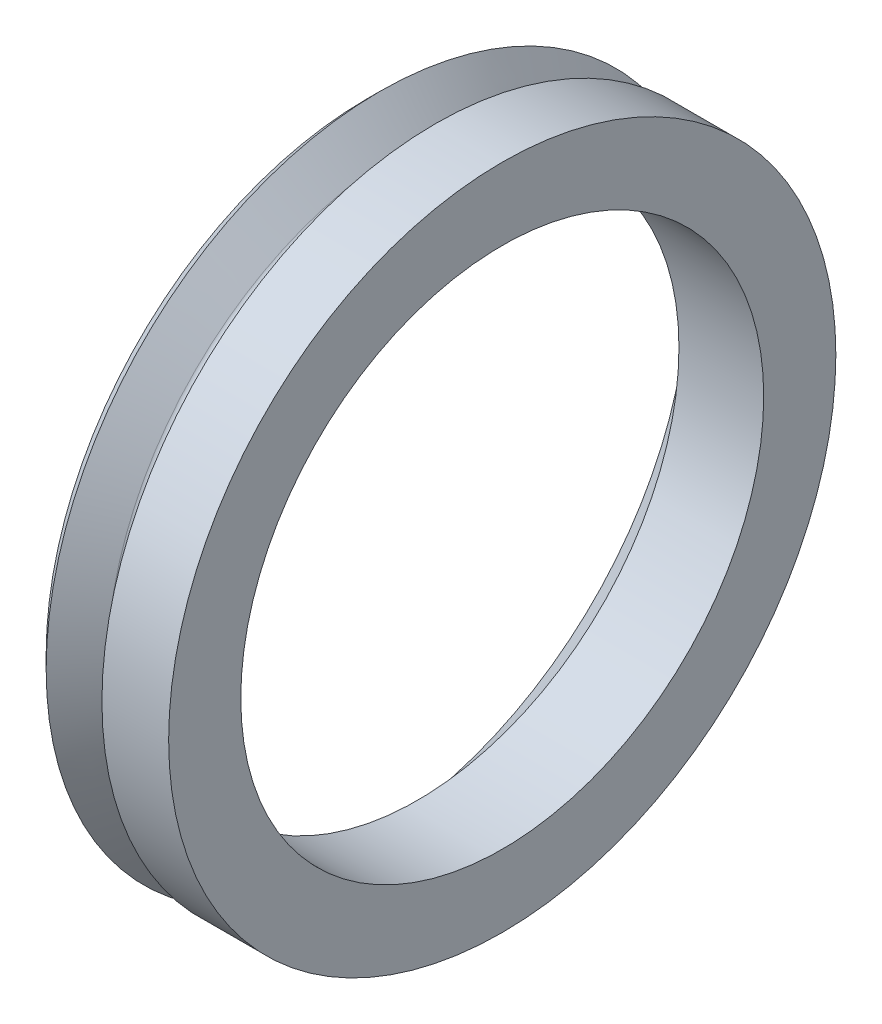
ISO-10303-21;
HEADER;
FILE_DESCRIPTION(('STEP AP214'),'2;1');
FILE_NAME('part.step','',(''),(''),'','','');
FILE_SCHEMA(('AUTOMOTIVE_DESIGN { 1 0 10303 214 1 1 1 1 }'));
ENDSEC;
DATA;
#1=APPLICATION_CONTEXT('core data for automotive mechanical design processes');
#2=APPLICATION_PROTOCOL_DEFINITION('international standard','automotive_design',2000,#1);
#3=PRODUCT_CONTEXT('',#1,'mechanical');
#4=PRODUCT('Part','Part','',(#3));
#5=PRODUCT_RELATED_PRODUCT_CATEGORY('part','',(#4));
#6=PRODUCT_DEFINITION_FORMATION('','',#4);
#7=PRODUCT_DEFINITION_CONTEXT('part definition',#1,'design');
#8=PRODUCT_DEFINITION('design','',#6,#7);
#9=PRODUCT_DEFINITION_SHAPE('','',#8);
#10=(LENGTH_UNIT() NAMED_UNIT(*) SI_UNIT(.MILLI.,.METRE.));
#11=(NAMED_UNIT(*) PLANE_ANGLE_UNIT() SI_UNIT($,.RADIAN.));
#12=(NAMED_UNIT(*) SI_UNIT($,.STERADIAN.) SOLID_ANGLE_UNIT());
#13=UNCERTAINTY_MEASURE_WITH_UNIT(LENGTH_MEASURE(1.E-05),#10,'distance_accuracy_value','');
#14=(GEOMETRIC_REPRESENTATION_CONTEXT(3) GLOBAL_UNCERTAINTY_ASSIGNED_CONTEXT((#13)) GLOBAL_UNIT_ASSIGNED_CONTEXT((#10,
#11,#12)) REPRESENTATION_CONTEXT('',''));
#15=CARTESIAN_POINT('',(0.,0.,0.));
#16=DIRECTION('',(0.,0.,1.));
#17=DIRECTION('',(1.,0.,0.));
#18=AXIS2_PLACEMENT_3D('',#15,#16,#17);
#19=CARTESIAN_POINT('',(0.707106781305811,0.,0.));
#20=DIRECTION('',(-1.,0.,0.));
#21=DIRECTION('',(0.,0.,1.));
#22=AXIS2_PLACEMENT_3D('',#19,#20,#21);
#23=CONICAL_SURFACE('',#22,18.4999999997899,0.866118799907619);
#24=CARTESIAN_POINT('',(0.707106781248967,0.,0.));
#25=DIRECTION('',(1.,0.,0.));
#26=DIRECTION('',(0.,0.,-1.));
#27=AXIS2_PLACEMENT_3D('',#24,#25,#26);
#28=CIRCLE('',#27,18.5000000000173);
#29=CARTESIAN_POINT('',(0.707106781248967,0.,-18.5000000000173));
#30=VERTEX_POINT('',#29);
#31=EDGE_CURVE('E30',#30,#30,#28,.F.);
#32=ORIENTED_EDGE('',*,*,#31,.F.);
#33=EDGE_LOOP('',(#32));
#34=FACE_BOUND('',#33,.T.);
#35=CARTESIAN_POINT('',(2.26609548856383,0.,0.));
#36=DIRECTION('',(1.,0.,0.));
#37=DIRECTION('',(0.,0.,-1.));
#38=AXIS2_PLACEMENT_3D('',#35,#36,#37);
#39=CIRCLE('',#38,16.6665773775966);
#40=CARTESIAN_POINT('',(2.26609548856383,0.,-16.6665773775966));
#41=VERTEX_POINT('',#40);
#42=EDGE_CURVE('E27',#41,#41,#39,.F.);
#43=ORIENTED_EDGE('',*,*,#42,.T.);
#44=EDGE_LOOP('',(#43));
#45=FACE_BOUND('',#44,.T.);
#46=ADVANCED_FACE('F15',(#34,#45),#23,.T.);
#47=CARTESIAN_POINT('',(2.64700573138622,0.,0.));
#48=DIRECTION('',(1.,0.,0.));
#49=DIRECTION('',(0.,0.,-1.));
#50=AXIS2_PLACEMENT_3D('',#47,#48,#49);
#51=TOROIDAL_SURFACE('',#50,16.9904714758957,0.499999999999995);
#52=CARTESIAN_POINT('',(3.1102329847954,0.,0.));
#53=DIRECTION('',(1.,0.,0.));
#54=DIRECTION('',(0.,0.,-1.));
#55=AXIS2_PLACEMENT_3D('',#52,#53,#54);
#56=CIRCLE('',#55,16.8022680973081);
#57=CARTESIAN_POINT('',(3.1102329847954,0.,-16.8022680973081));
#58=VERTEX_POINT('',#57);
#59=EDGE_CURVE('E33',#58,#58,#56,.T.);
#60=ORIENTED_EDGE('',*,*,#59,.F.);
#61=EDGE_LOOP('',(#60));
#62=FACE_BOUND('',#61,.T.);
#63=ORIENTED_EDGE('',*,*,#42,.F.);
#64=EDGE_LOOP('',(#63));
#65=FACE_BOUND('',#64,.T.);
#66=ADVANCED_FACE('F37',(#62,#65),#51,.F.);
#67=CARTESIAN_POINT('',(0.707106781248967,0.,0.));
#68=DIRECTION('',(1.,0.,0.));
#69=DIRECTION('',(0.,0.,-1.));
#70=AXIS2_PLACEMENT_3D('',#67,#68,#69);
#71=CONICAL_SURFACE('',#70,18.5000000000173,0.785398163397448);
#72=ORIENTED_EDGE('',*,*,#31,.T.);
#73=EDGE_LOOP('',(#72));
#74=FACE_BOUND('',#73,.T.);
#75=CARTESIAN_POINT('',(-5.6843418860808E-11,0.,0.));
#76=DIRECTION('',(-1.,0.,0.));
#77=DIRECTION('',(0.,0.,1.));
#78=AXIS2_PLACEMENT_3D('',#75,#76,#77);
#79=CIRCLE('',#78,17.7928932187683);
#80=CARTESIAN_POINT('',(-5.6843418860808E-11,0.,17.7928932187683));
#81=VERTEX_POINT('',#80);
#82=EDGE_CURVE('E131',#81,#81,#79,.F.);
#83=ORIENTED_EDGE('',*,*,#82,.T.);
#84=EDGE_LOOP('',(#83));
#85=FACE_BOUND('',#84,.T.);
#86=ADVANCED_FACE('F40',(#74,#85),#71,.T.);
#87=CARTESIAN_POINT('',(3.79999999998404,0.,0.));
#88=DIRECTION('',(1.,0.,0.));
#89=DIRECTION('',(0.,1.,0.));
#90=AXIS2_PLACEMENT_3D('',#87,#88,#89);
#91=CONICAL_SURFACE('',#90,18.4999999999604,1.1848815889704);
#92=ORIENTED_EDGE('',*,*,#59,.T.);
#93=EDGE_LOOP('',(#92));
#94=FACE_BOUND('',#93,.T.);
#95=CARTESIAN_POINT('',(3.8,0.,0.));
#96=DIRECTION('',(-1.,0.,0.));
#97=DIRECTION('',(0.,0.,1.));
#98=AXIS2_PLACEMENT_3D('',#95,#96,#97);
#99=CIRCLE('',#98,18.5);
#100=CARTESIAN_POINT('',(3.8,0.,18.5));
#101=VERTEX_POINT('',#100);
#102=EDGE_CURVE('E133',#101,#101,#99,.F.);
#103=ORIENTED_EDGE('',*,*,#102,.F.);
#104=EDGE_LOOP('',(#103));
#105=FACE_BOUND('',#104,.T.);
#106=ADVANCED_FACE('F44',(#94,#105),#91,.T.);
#107=CARTESIAN_POINT('',(1.13686837721616E-10,0.,0.));
#108=DIRECTION('',(-1.,0.,0.));
#109=DIRECTION('',(0.,0.,1.));
#110=AXIS2_PLACEMENT_3D('',#107,#108,#109);
#111=CONICAL_SURFACE('',#110,17.7928932185978,0.86611879990446);
#112=CARTESIAN_POINT('',(2.80000000000003,0.,0.));
#113=DIRECTION('',(-1.,0.,0.));
#114=DIRECTION('',(0.,0.,1.));
#115=AXIS2_PLACEMENT_3D('',#112,#113,#114);
#116=CIRCLE('',#115,14.5);
#117=CARTESIAN_POINT('',(2.80000000000003,0.,14.5));
#118=VERTEX_POINT('',#117);
#119=EDGE_CURVE('E25',#118,#118,#116,.F.);
#120=ORIENTED_EDGE('',*,*,#119,.T.);
#121=EDGE_LOOP('',(#120));
#122=FACE_BOUND('',#121,.T.);
#123=ORIENTED_EDGE('',*,*,#82,.F.);
#124=EDGE_LOOP('',(#123));
#125=FACE_BOUND('',#124,.T.);
#126=ADVANCED_FACE('F48',(#122,#125),#111,.F.);
#127=CARTESIAN_POINT('',(50.,0.,0.));
#128=DIRECTION('',(-1.,0.,0.));
#129=DIRECTION('',(0.,0.,1.));
#130=AXIS2_PLACEMENT_3D('',#127,#128,#129);
#131=CYLINDRICAL_SURFACE('',#130,18.5);
#132=ORIENTED_EDGE('',*,*,#102,.T.);
#133=EDGE_LOOP('',(#132));
#134=FACE_BOUND('',#133,.T.);
#135=CARTESIAN_POINT('',(7.5,0.,0.));
#136=DIRECTION('',(-1.,0.,0.));
#137=DIRECTION('',(0.,0.,1.));
#138=AXIS2_PLACEMENT_3D('',#135,#136,#137);
#139=CIRCLE('',#138,18.5);
#140=CARTESIAN_POINT('',(7.5,0.,18.5));
#141=VERTEX_POINT('',#140);
#142=EDGE_CURVE('E18',#141,#141,#139,.F.);
#143=ORIENTED_EDGE('',*,*,#142,.F.);
#144=EDGE_LOOP('',(#143));
#145=FACE_BOUND('',#144,.T.);
#146=ADVANCED_FACE('F52',(#134,#145),#131,.T.);
#147=CARTESIAN_POINT('',(50.,0.,0.));
#148=DIRECTION('',(-1.,0.,0.));
#149=DIRECTION('',(0.,0.,1.));
#150=AXIS2_PLACEMENT_3D('',#147,#148,#149);
#151=CYLINDRICAL_SURFACE('',#150,14.5);
#152=ORIENTED_EDGE('',*,*,#119,.F.);
#153=EDGE_LOOP('',(#152));
#154=FACE_BOUND('',#153,.T.);
#155=CARTESIAN_POINT('',(7.5,0.,0.));
#156=DIRECTION('',(-1.,0.,0.));
#157=DIRECTION('',(0.,0.,1.));
#158=AXIS2_PLACEMENT_3D('',#155,#156,#157);
#159=CIRCLE('',#158,14.5);
#160=CARTESIAN_POINT('',(7.5,0.,14.5));
#161=VERTEX_POINT('',#160);
#162=EDGE_CURVE('E10',#161,#161,#159,.T.);
#163=ORIENTED_EDGE('',*,*,#162,.F.);
#164=EDGE_LOOP('',(#163));
#165=FACE_BOUND('',#164,.T.);
#166=ADVANCED_FACE('F56',(#154,#165),#151,.F.);
#167=CARTESIAN_POINT('',(7.5,14.5,0.));
#168=DIRECTION('',(1.,0.,0.));
#169=DIRECTION('',(0.,0.,-1.));
#170=AXIS2_PLACEMENT_3D('',#167,#168,#169);
#171=PLANE('',#170);
#172=ORIENTED_EDGE('',*,*,#162,.T.);
#173=EDGE_LOOP('',(#172));
#174=FACE_BOUND('',#173,.T.);
#175=ORIENTED_EDGE('',*,*,#142,.T.);
#176=EDGE_LOOP('',(#175));
#177=FACE_BOUND('',#176,.T.);
#178=ADVANCED_FACE('F60',(#174,#177),#171,.T.);
#179=CLOSED_SHELL('',(#46,#66,#86,#106,#126,#146,#166,#178));
#180=MANIFOLD_SOLID_BREP('B1',#179);
#181=ADVANCED_BREP_SHAPE_REPRESENTATION('',(#18,#180),#14);
#182=SHAPE_DEFINITION_REPRESENTATION(#9,#181);
ENDSEC;
END-ISO-10303-21;
